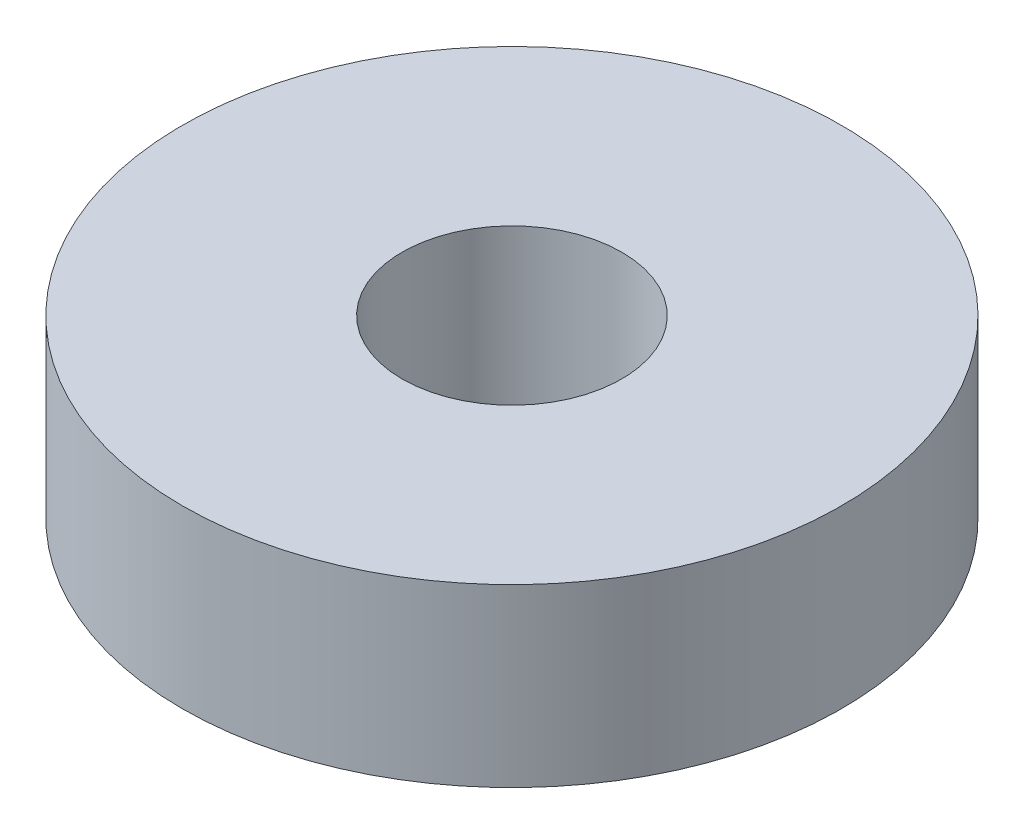
ISO-10303-21;
HEADER;
FILE_DESCRIPTION(('STEP AP214'),'2;1');
FILE_NAME('part.step','',(''),(''),'','','');
FILE_SCHEMA(('AUTOMOTIVE_DESIGN { 1 0 10303 214 1 1 1 1 }'));
ENDSEC;
DATA;
#1=APPLICATION_CONTEXT('core data for automotive mechanical design processes');
#2=APPLICATION_PROTOCOL_DEFINITION('international standard','automotive_design',2000,#1);
#3=PRODUCT_CONTEXT('',#1,'mechanical');
#4=PRODUCT('Part','Part','',(#3));
#5=PRODUCT_RELATED_PRODUCT_CATEGORY('part','',(#4));
#6=PRODUCT_DEFINITION_FORMATION('','',#4);
#7=PRODUCT_DEFINITION_CONTEXT('part definition',#1,'design');
#8=PRODUCT_DEFINITION('design','',#6,#7);
#9=PRODUCT_DEFINITION_SHAPE('','',#8);
#10=(LENGTH_UNIT() NAMED_UNIT(*) SI_UNIT(.MILLI.,.METRE.));
#11=(NAMED_UNIT(*) PLANE_ANGLE_UNIT() SI_UNIT($,.RADIAN.));
#12=(NAMED_UNIT(*) SI_UNIT($,.STERADIAN.) SOLID_ANGLE_UNIT());
#13=UNCERTAINTY_MEASURE_WITH_UNIT(LENGTH_MEASURE(1.E-05),#10,'distance_accuracy_value','');
#14=(GEOMETRIC_REPRESENTATION_CONTEXT(3) GLOBAL_UNCERTAINTY_ASSIGNED_CONTEXT((#13)) GLOBAL_UNIT_ASSIGNED_CONTEXT((#10,
#11,#12)) REPRESENTATION_CONTEXT('',''));
#15=CARTESIAN_POINT('',(0.,0.,0.));
#16=DIRECTION('',(0.,0.,1.));
#17=DIRECTION('',(1.,0.,0.));
#18=AXIS2_PLACEMENT_3D('',#15,#16,#17);
#19=CARTESIAN_POINT('',(0.,4.,0.));
#20=DIRECTION('',(0.,1.,0.));
#21=DIRECTION('',(0.,0.,1.));
#22=AXIS2_PLACEMENT_3D('',#19,#20,#21);
#23=PLANE('',#22);
#24=CARTESIAN_POINT('',(0.,4.,0.));
#25=DIRECTION('',(0.,1.,0.));
#26=DIRECTION('',(0.,0.,1.));
#27=AXIS2_PLACEMENT_3D('',#24,#25,#26);
#28=CIRCLE('',#27,7.5);
#29=CARTESIAN_POINT('',(0.,4.,7.5));
#30=VERTEX_POINT('',#29);
#31=EDGE_CURVE('E10',#30,#30,#28,.T.);
#32=ORIENTED_EDGE('',*,*,#31,.T.);
#33=EDGE_LOOP('',(#32));
#34=FACE_BOUND('',#33,.T.);
#35=CARTESIAN_POINT('',(0.,4.,0.));
#36=DIRECTION('',(0.,1.,0.));
#37=DIRECTION('',(0.,0.,1.));
#38=AXIS2_PLACEMENT_3D('',#35,#36,#37);
#39=CIRCLE('',#38,2.5);
#40=CARTESIAN_POINT('',(0.,4.,2.5));
#41=VERTEX_POINT('',#40);
#42=EDGE_CURVE('E54',#41,#41,#39,.T.);
#43=ORIENTED_EDGE('',*,*,#42,.F.);
#44=EDGE_LOOP('',(#43));
#45=FACE_BOUND('',#44,.T.);
#46=ADVANCED_FACE('F41',(#34,#45),#23,.T.);
#47=CARTESIAN_POINT('',(0.,0.,0.));
#48=DIRECTION('',(0.,1.,0.));
#49=DIRECTION('',(0.,0.,1.));
#50=AXIS2_PLACEMENT_3D('',#47,#48,#49);
#51=PLANE('',#50);
#52=CARTESIAN_POINT('',(0.,0.,0.));
#53=DIRECTION('',(0.,1.,0.));
#54=DIRECTION('',(0.,0.,1.));
#55=AXIS2_PLACEMENT_3D('',#52,#53,#54);
#56=CIRCLE('',#55,7.5);
#57=CARTESIAN_POINT('',(0.,0.,7.5));
#58=VERTEX_POINT('',#57);
#59=EDGE_CURVE('E45',#58,#58,#56,.T.);
#60=ORIENTED_EDGE('',*,*,#59,.F.);
#61=EDGE_LOOP('',(#60));
#62=FACE_BOUND('',#61,.T.);
#63=CARTESIAN_POINT('',(0.,0.,0.));
#64=DIRECTION('',(0.,1.,0.));
#65=DIRECTION('',(0.,0.,1.));
#66=AXIS2_PLACEMENT_3D('',#63,#64,#65);
#67=CIRCLE('',#66,2.5);
#68=CARTESIAN_POINT('',(0.,0.,2.5));
#69=VERTEX_POINT('',#68);
#70=EDGE_CURVE('E56',#69,#69,#67,.T.);
#71=ORIENTED_EDGE('',*,*,#70,.T.);
#72=EDGE_LOOP('',(#71));
#73=FACE_BOUND('',#72,.T.);
#74=ADVANCED_FACE('F68',(#62,#73),#51,.F.);
#75=CARTESIAN_POINT('',(0.,4.,0.));
#76=DIRECTION('',(0.,-1.,0.));
#77=DIRECTION('',(0.,0.,-1.));
#78=AXIS2_PLACEMENT_3D('',#75,#76,#77);
#79=CYLINDRICAL_SURFACE('',#78,7.5);
#80=ORIENTED_EDGE('',*,*,#31,.F.);
#81=EDGE_LOOP('',(#80));
#82=FACE_BOUND('',#81,.T.);
#83=ORIENTED_EDGE('',*,*,#59,.T.);
#84=EDGE_LOOP('',(#83));
#85=FACE_BOUND('',#84,.T.);
#86=ADVANCED_FACE('F43',(#82,#85),#79,.T.);
#87=CARTESIAN_POINT('',(0.,4.,0.));
#88=DIRECTION('',(0.,-1.,0.));
#89=DIRECTION('',(0.,0.,-1.));
#90=AXIS2_PLACEMENT_3D('',#87,#88,#89);
#91=CYLINDRICAL_SURFACE('',#90,2.5);
#92=ORIENTED_EDGE('',*,*,#42,.T.);
#93=EDGE_LOOP('',(#92));
#94=FACE_BOUND('',#93,.T.);
#95=ORIENTED_EDGE('',*,*,#70,.F.);
#96=EDGE_LOOP('',(#95));
#97=FACE_BOUND('',#96,.T.);
#98=ADVANCED_FACE('F64',(#94,#97),#91,.F.);
#99=CLOSED_SHELL('',(#46,#74,#86,#98));
#100=MANIFOLD_SOLID_BREP('B2',#99);
#101=ADVANCED_BREP_SHAPE_REPRESENTATION('',(#18,#100),#14);
#102=SHAPE_DEFINITION_REPRESENTATION(#9,#101);
ENDSEC;
END-ISO-10303-21;
